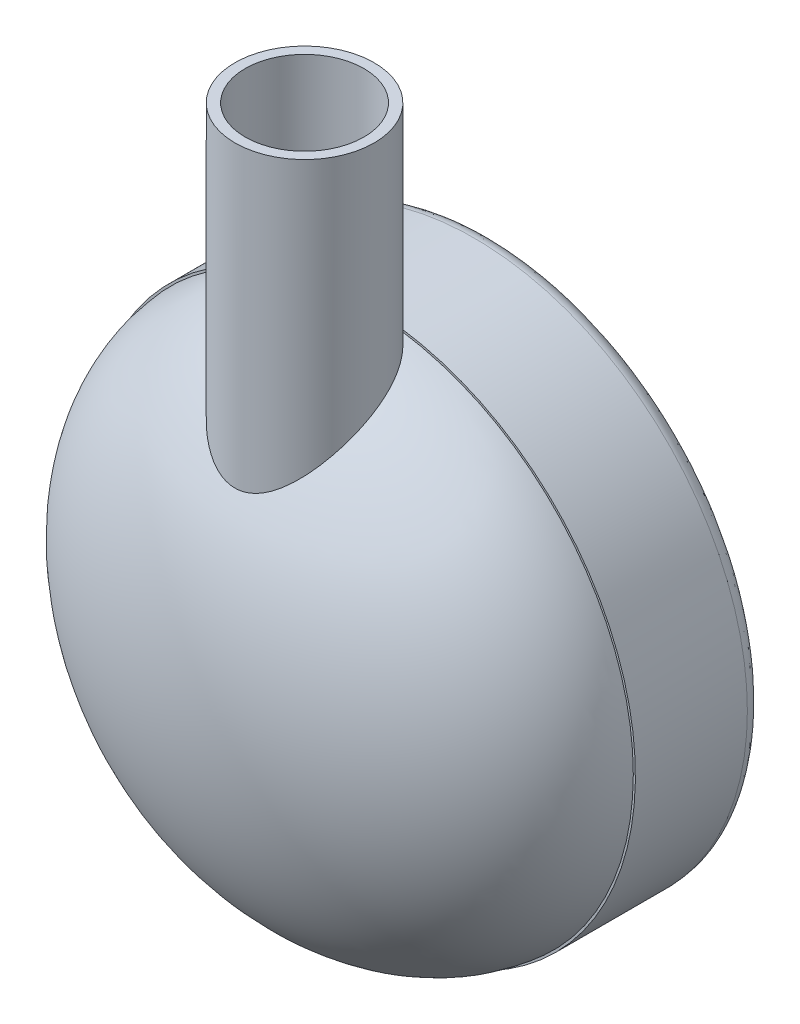
ISO-10303-21;
HEADER;
FILE_DESCRIPTION(('STEP AP214'),'2;1');
FILE_NAME('part.step','',(''),(''),'','','');
FILE_SCHEMA(('AUTOMOTIVE_DESIGN { 1 0 10303 214 1 1 1 1 }'));
ENDSEC;
DATA;
#1=APPLICATION_CONTEXT('core data for automotive mechanical design processes');
#2=APPLICATION_PROTOCOL_DEFINITION('international standard','automotive_design',2000,#1);
#3=PRODUCT_CONTEXT('',#1,'mechanical');
#4=PRODUCT('Part','Part','',(#3));
#5=PRODUCT_RELATED_PRODUCT_CATEGORY('part','',(#4));
#6=PRODUCT_DEFINITION_FORMATION('','',#4);
#7=PRODUCT_DEFINITION_CONTEXT('part definition',#1,'design');
#8=PRODUCT_DEFINITION('design','',#6,#7);
#9=PRODUCT_DEFINITION_SHAPE('','',#8);
#10=(LENGTH_UNIT() NAMED_UNIT(*) SI_UNIT(.MILLI.,.METRE.));
#11=(NAMED_UNIT(*) PLANE_ANGLE_UNIT() SI_UNIT($,.RADIAN.));
#12=(NAMED_UNIT(*) SI_UNIT($,.STERADIAN.) SOLID_ANGLE_UNIT());
#13=UNCERTAINTY_MEASURE_WITH_UNIT(LENGTH_MEASURE(1.E-05),#10,'distance_accuracy_value','');
#14=(GEOMETRIC_REPRESENTATION_CONTEXT(3) GLOBAL_UNCERTAINTY_ASSIGNED_CONTEXT((#13)) GLOBAL_UNIT_ASSIGNED_CONTEXT((#10,
#11,#12)) REPRESENTATION_CONTEXT('',''));
#15=CARTESIAN_POINT('',(0.,0.,0.));
#16=DIRECTION('',(0.,0.,1.));
#17=DIRECTION('',(1.,0.,0.));
#18=AXIS2_PLACEMENT_3D('',#15,#16,#17);
#19=CARTESIAN_POINT('',(0.,0.,30.));
#20=DIRECTION('',(0.,0.,-1.));
#21=DIRECTION('',(-1.,0.,0.));
#22=AXIS2_PLACEMENT_3D('',#19,#20,#21);
#23=CYLINDRICAL_SURFACE('',#22,80.5);
#24=CARTESIAN_POINT('',(0.,0.,0.));
#25=DIRECTION('',(0.,0.,-1.));
#26=DIRECTION('',(-1.,0.,0.));
#27=AXIS2_PLACEMENT_3D('',#24,#25,#26);
#28=CIRCLE('',#27,80.5);
#29=CARTESIAN_POINT('',(-80.5,0.,0.));
#30=VERTEX_POINT('',#29);
#31=EDGE_CURVE('E153',#30,#30,#28,.F.);
#32=ORIENTED_EDGE('',*,*,#31,.T.);
#33=EDGE_LOOP('',(#32));
#34=FACE_BOUND('',#33,.T.);
#35=CARTESIAN_POINT('',(11.4564392373896,79.6806124474455,33.));
#36=CARTESIAN_POINT('',(11.2220878181094,79.7143080596752,32.8420695559462));
#37=CARTESIAN_POINT('',(10.9844403989187,79.7474206190719,32.6889638842848));
#38=CARTESIAN_POINT('',(10.5028781935094,79.8122708437409,32.3926292261067));
#39=CARTESIAN_POINT('',(10.2589633173115,79.8440084892566,32.2494003814964));
#40=CARTESIAN_POINT('',(9.51837233566594,79.9368372093775,31.8349086606179));
#41=CARTESIAN_POINT('',(9.01279502691787,79.9955520296584,31.5788036300058));
#42=CARTESIAN_POINT('',(7.98141239486232,80.1050317111238,31.1090413243134));
#43=CARTESIAN_POINT('',(7.45560330592912,80.1557950833476,30.8953919973342));
#44=CARTESIAN_POINT('',(6.38735518565271,80.247984486276,30.5122188539234));
#45=CARTESIAN_POINT('',(5.84491709910179,80.2894110463477,30.3426925357756));
#46=CARTESIAN_POINT('',(4.74650586940751,80.3618315878747,30.048952789869));
#47=CARTESIAN_POINT('',(4.19051693906464,80.3928127093453,29.9247952025444));
#48=CARTESIAN_POINT('',(3.0696105183615,80.4434100431825,29.7231224558775));
#49=CARTESIAN_POINT('',(2.50469279579955,80.4630259594851,29.6456085116022));
#50=CARTESIAN_POINT('',(1.37040728600083,80.4903325010212,29.5379291297171));
#51=CARTESIAN_POINT('',(0.801042291539302,80.4980300868901,29.5077360552813));
#52=CARTESIAN_POINT('',(-0.338240826486871,80.5013047403233,29.4948760425023));
#53=CARTESIAN_POINT('',(-0.908158928664438,80.4968822592235,29.5122073344118));
#54=CARTESIAN_POINT('',(-2.03495667165941,80.4762153616848,29.5935613022524));
#55=CARTESIAN_POINT('',(-2.59189615721838,80.4601674796119,29.6568077918934));
#56=CARTESIAN_POINT('',(-3.69833472982087,80.4169066962689,29.8285899591556));
#57=CARTESIAN_POINT('',(-4.24783336397076,80.3896931185167,29.9371283808294));
#58=CARTESIAN_POINT('',(-5.33551582789555,80.3248345972038,30.1986091992802));
#59=CARTESIAN_POINT('',(-5.87370010188997,80.2871900640048,30.3515498492515));
#60=CARTESIAN_POINT('',(-6.9349197652561,80.2024957635583,30.7005457520391));
#61=CARTESIAN_POINT('',(-7.45795910394596,80.1554484740048,30.8965896481999));
#62=CARTESIAN_POINT('',(-8.58287968067422,80.0434930923536,31.3714279836359));
#63=CARTESIAN_POINT('',(-9.18098787882736,79.9768898911349,31.6588587115187));
#64=CARTESIAN_POINT('',(-10.0536599917039,79.8702687768623,32.1315015853088));
#65=CARTESIAN_POINT('',(-10.3401930960773,79.8336492123653,32.2957793417602));
#66=CARTESIAN_POINT('',(-10.9047898713895,79.7584893744684,32.6378450439411));
#67=CARTESIAN_POINT('',(-11.182854172701,79.7199492445909,32.8156319806594));
#68=CARTESIAN_POINT('',(-11.4564392373896,79.6806124474455,33.));
#69=B_SPLINE_CURVE_WITH_KNOTS('',3,(#35,#36,#37,#38,#39,#40,#41,#42,#43,#44,#45,#46,#47,#48,#49,
#50,#51,#52,#53,#54,#55,#56,#57,#58,#59,#60,#61,#62,#63,#64,#65,#66,#67,#68),.UNSPECIFIED.,.F.,
.F.,(4,2,2,2,2,2,2,2,2,2,2,2,2,2,2,2,4),(0.,0.853678396150907,1.7073690550526,3.41455112675234,
5.12205249828092,6.82945703564197,8.53895604650668,10.248499587896,11.9570443313581,
13.6655254516456,15.3457783163897,17.0261329955513,18.7064215776792,20.386267974087,
22.3834734499622,23.380073619323,24.3765994248601),.UNSPECIFIED.);
#70=CARTESIAN_POINT('',(11.4564392373896,79.6806124474455,33.));
#71=VERTEX_POINT('',#70);
#72=CARTESIAN_POINT('',(-11.4564392373896,79.6806124474455,33.));
#73=VERTEX_POINT('',#72);
#74=EDGE_CURVE('E11',#71,#73,#69,.T.);
#75=ORIENTED_EDGE('',*,*,#74,.F.);
#76=CARTESIAN_POINT('',(0.,0.,33.));
#77=DIRECTION('',(0.,0.,1.));
#78=DIRECTION('',(1.,0.,0.));
#79=AXIS2_PLACEMENT_3D('',#76,#77,#78);
#80=CIRCLE('',#79,80.5);
#81=EDGE_CURVE('E154',#73,#71,#80,.T.);
#82=ORIENTED_EDGE('',*,*,#81,.F.);
#83=EDGE_LOOP('',(#75,#82));
#84=FACE_BOUND('',#83,.T.);
#85=ADVANCED_FACE('F35',(#34,#84),#23,.T.);
#86=CARTESIAN_POINT('',(0.,0.,33.));
#87=DIRECTION('',(0.,0.,1.));
#88=DIRECTION('',(1.,0.,0.));
#89=AXIS2_PLACEMENT_3D('',#86,#87,#88);
#90=PLANE('',#89);
#91=CARTESIAN_POINT('',(0.,0.,33.));
#92=DIRECTION('',(0.,0.,1.));
#93=DIRECTION('',(1.,0.,0.));
#94=AXIS2_PLACEMENT_3D('',#91,#92,#93);
#95=CIRCLE('',#94,79.8813474866826);
#96=CARTESIAN_POINT('',(11.4564392373896,79.0555480424248,33.));
#97=VERTEX_POINT('',#96);
#98=CARTESIAN_POINT('',(-11.4564392373896,79.0555480424248,33.));
#99=VERTEX_POINT('',#98);
#100=EDGE_CURVE('E158',#97,#99,#95,.F.);
#101=ORIENTED_EDGE('',*,*,#100,.T.);
#102=DIRECTION('',(0.,-1.,0.));
#103=VECTOR('',#102,1.);
#104=CARTESIAN_POINT('',(-11.4564392373896,140.,33.));
#105=LINE('',#104,#103);
#106=EDGE_CURVE('E50',#99,#73,#105,.F.);
#107=ORIENTED_EDGE('',*,*,#106,.T.);
#108=ORIENTED_EDGE('',*,*,#81,.T.);
#109=DIRECTION('',(0.,-1.,0.));
#110=VECTOR('',#109,1.);
#111=CARTESIAN_POINT('',(11.4564392373896,140.,33.));
#112=LINE('',#111,#110);
#113=EDGE_CURVE('E168',#71,#97,#112,.T.);
#114=ORIENTED_EDGE('',*,*,#113,.T.);
#115=EDGE_LOOP('',(#101,#107,#108,#114));
#116=FACE_BOUND('',#115,.T.);
#117=ADVANCED_FACE('F130',(#116),#90,.T.);
#118=CARTESIAN_POINT('',(0.,0.,30.1));
#119=DIRECTION('',(0.,1.,0.));
#120=DIRECTION('',(1.,0.,0.));
#121=AXIS2_PLACEMENT_3D('',#118,#119,#120);
#122=ELLIPSE('',#121,77.,50.);
#123=TRIMMED_CURVE('',#122,(PARAMETER_VALUE(4.71238898038469)),
(PARAMETER_VALUE(7.85398163397448)),.T.,.PARAMETER.);
#124=CARTESIAN_POINT('',(0.,0.,-19.9));
#125=DIRECTION('',(0.,0.,1.));
#126=AXIS1_PLACEMENT('',#124,#125);
#127=SURFACE_OF_REVOLUTION('',#123,#126);
#128=OFFSET_SURFACE('',#127,-3.,.F.);
#129=ORIENTED_EDGE('',*,*,#100,.F.);
#130=CARTESIAN_POINT('',(1.1771202021654,51.9456892143006,70.4661766832414));
#131=CARTESIAN_POINT('',(0.907322077847377,51.9242769759187,70.4816936369536));
#132=CARTESIAN_POINT('',(0.636616901980984,51.9101660988673,70.4919048306884));
#133=CARTESIAN_POINT('',(0.0945109224228792,51.8968023200685,70.5015757745882));
#134=CARTESIAN_POINT('',(-0.176890176285591,51.8975573837835,70.5010297608304));
#135=CARTESIAN_POINT('',(-0.719021243421869,51.9139298703364,70.4891805670991));
#136=CARTESIAN_POINT('',(-0.989751179835766,51.9295479889568,70.4778768835279));
#137=CARTESIAN_POINT('',(-1.52973580034227,51.975406116933,70.4446375255701));
#138=CARTESIAN_POINT('',(-1.79898748676616,52.0056691330893,70.4226851221563));
#139=CARTESIAN_POINT('',(-2.33445363247133,52.0803076170262,70.3684249940721));
#140=CARTESIAN_POINT('',(-2.60066824041427,52.1246823909547,70.3361177785302));
#141=CARTESIAN_POINT('',(-3.12905815096226,52.2268183924922,70.2615451526845));
#142=CARTESIAN_POINT('',(-3.39123368659885,52.2845788447155,70.2192803191883));
#143=CARTESIAN_POINT('',(-4.0364719146983,52.4436324671629,70.1024934274612));
#144=CARTESIAN_POINT('',(-4.41666767779466,52.5524684520911,70.0222570684141));
#145=CARTESIAN_POINT('',(-5.16438605811431,52.7946124625367,69.8425571078895));
#146=CARTESIAN_POINT('',(-5.53190858512191,52.9279206622192,69.7430933695732));
#147=CARTESIAN_POINT('',(-6.25329881600127,53.2158528450043,69.5266008811629));
#148=CARTESIAN_POINT('',(-6.60716061790826,53.3704859122358,69.4095646435065));
#149=CARTESIAN_POINT('',(-7.30058918475854,53.698008791176,69.1595226604113));
#150=CARTESIAN_POINT('',(-7.64015137454638,53.8709043848257,69.0265118555653));
#151=CARTESIAN_POINT('',(-8.23410023492203,54.1937407892544,68.7757896973052));
#152=CARTESIAN_POINT('',(-8.49125808991869,54.3407562266536,68.6608301731225));
#153=CARTESIAN_POINT('',(-8.99654084786696,54.6431111748135,68.4225473472501));
#154=CARTESIAN_POINT('',(-9.24466751808899,54.7984490421293,68.299225695576));
#155=CARTESIAN_POINT('',(-9.97601874239879,55.2755027078987,67.9173594752607));
#156=CARTESIAN_POINT('',(-10.4460302263319,55.6081567376633,67.6469922735699));
#157=CARTESIAN_POINT('',(-11.3528707859573,56.2958336028017,67.0777527424232));
#158=CARTESIAN_POINT('',(-11.7896220298923,56.6509055518844,66.7788170332602));
#159=CARTESIAN_POINT('',(-12.6302937681159,57.3770357567384,66.1554768323128));
#160=CARTESIAN_POINT('',(-13.0342157844136,57.7480932701749,65.8310735226146));
#161=CARTESIAN_POINT('',(-13.7911471814128,58.4829143872954,65.1753863548209));
#162=CARTESIAN_POINT('',(-14.1456887019945,58.8461253088704,64.8452439719049));
#163=CARTESIAN_POINT('',(-14.8270608371628,59.5798222856372,64.1647505843524));
#164=CARTESIAN_POINT('',(-15.153882417462,59.9503106645641,63.8143930533724));
#165=CARTESIAN_POINT('',(-15.7801436114819,60.6958439483162,63.094453700841));
#166=CARTESIAN_POINT('',(-16.0795789922769,61.0708895474099,62.7248689212486));
#167=CARTESIAN_POINT('',(-16.6512937658079,61.8234519987607,61.9670319489944));
#168=CARTESIAN_POINT('',(-16.9235547214568,62.2009703461203,61.5787673437578));
#169=CARTESIAN_POINT('',(-17.4404274881262,62.9561473161747,60.7845223676012));
#170=CARTESIAN_POINT('',(-17.6850440675943,63.3338059033691,60.378545068785));
#171=CARTESIAN_POINT('',(-18.146137783587,64.0874539158083,59.5494856203579));
#172=CARTESIAN_POINT('',(-18.3626152572949,64.4634433610019,59.126403675787));
#173=CARTESIAN_POINT('',(-18.8710324349779,65.405442696745,58.040891132559));
#174=CARTESIAN_POINT('',(-19.1442188091166,65.9693221923184,57.3676759768447));
#175=CARTESIAN_POINT('',(-19.6201896410432,67.0835967827264,55.9859990803645));
#176=CARTESIAN_POINT('',(-19.8229654201098,67.6339902075194,55.2775330069105));
#177=CARTESIAN_POINT('',(-20.1526472167949,68.7147504924083,53.8301778893839));
#178=CARTESIAN_POINT('',(-20.2796985811014,69.2451538757294,53.0913500563877));
#179=CARTESIAN_POINT('',(-20.4092370685412,70.0219804287761,51.9637156058618));
#180=CARTESIAN_POINT('',(-20.4422432129018,70.2777673975958,51.5846455115601));
#181=CARTESIAN_POINT('',(-20.4871433911399,70.7825608256285,50.8206220873119));
#182=CARTESIAN_POINT('',(-20.4990323239405,71.0315656322417,50.4356673585165));
#183=CARTESIAN_POINT('',(-20.5012687837532,71.6337047855752,49.4844662464468));
#184=CARTESIAN_POINT('',(-20.4793457671317,71.9826379527059,48.9154686817445));
#185=CARTESIAN_POINT('',(-20.386520941057,72.6622895218595,47.7707814448194));
#186=CARTESIAN_POINT('',(-20.315630618574,72.9930121761445,47.195093373219));
#187=CARTESIAN_POINT('',(-20.1226235184678,73.6342469324265,46.0412092338059));
#188=CARTESIAN_POINT('',(-20.0005230200324,73.9447654209162,45.4630140207434));
#189=CARTESIAN_POINT('',(-19.7031915917022,74.5438835462094,44.3088362918556));
#190=CARTESIAN_POINT('',(-19.5279591041156,74.8324825400801,43.732853841404));
#191=CARTESIAN_POINT('',(-19.1216919812357,75.3880698138824,42.5848770925239));
#192=CARTESIAN_POINT('',(-18.8902907883314,75.6549000849168,42.01293549095));
#193=CARTESIAN_POINT('',(-18.3717704514017,76.1635904647641,40.8832990708541));
#194=CARTESIAN_POINT('',(-18.0846504887596,76.4054502066315,40.3256044617841));
#195=CARTESIAN_POINT('',(-17.4552379696664,76.8634083602064,39.2313935958132));
#196=CARTESIAN_POINT('',(-17.1129639954091,77.0795154058658,38.6948702815182));
#197=CARTESIAN_POINT('',(-16.3746843348328,77.4858690895823,37.6497411285205));
#198=CARTESIAN_POINT('',(-15.9786851785477,77.6761188648476,37.1411319075316));
#199=CARTESIAN_POINT('',(-15.1833395976969,78.0110167953899,36.2142897816272));
#200=CARTESIAN_POINT('',(-14.7894516624078,78.1583892872092,35.7923450914721));
#201=CARTESIAN_POINT('',(-13.963945089781,78.4336807148475,34.9802332770595));
#202=CARTESIAN_POINT('',(-13.5323294340281,78.5616011857555,34.5900636463494));
#203=CARTESIAN_POINT('',(-12.6344865014243,78.798783008375,33.8457518432893));
#204=CARTESIAN_POINT('',(-12.1682672309346,78.9080486571294,33.4916013817269));
#205=CARTESIAN_POINT('',(-11.2046237950124,79.1089501535856,32.8229720202554));
#206=CARTESIAN_POINT('',(-10.7072002621657,79.2005863585258,32.5084923165132));
#207=CARTESIAN_POINT('',(-9.71308122610797,79.3627378315489,31.9385452204431));
#208=CARTESIAN_POINT('',(-9.217839978377,79.4341354157128,31.6807881803416));
#209=CARTESIAN_POINT('',(-8.20650000205881,79.5630653322533,31.2059746090839));
#210=CARTESIAN_POINT('',(-7.69040220427248,79.6205982825945,30.9889162640302));
#211=CARTESIAN_POINT('',(-6.64107736025471,79.7226586845498,30.597431299746));
#212=CARTESIAN_POINT('',(-6.10785135808902,79.7671869272147,30.4230020875751));
#213=CARTESIAN_POINT('',(-5.0280696930589,79.8439923901004,30.1182693173141));
#214=CARTESIAN_POINT('',(-4.48151391537729,79.8762695047554,29.9879661394515));
#215=CARTESIAN_POINT('',(-3.38213762977831,79.9290140241954,29.7732093941544));
#216=CARTESIAN_POINT('',(-2.82937024900087,79.9495473844521,29.6884999241046));
#217=CARTESIAN_POINT('',(-1.71846873707464,79.9794817957322,29.5645104870098));
#218=CARTESIAN_POINT('',(-1.16033464304923,79.9888829237053,29.5252302059433));
#219=CARTESIAN_POINT('',(-0.0426348133667449,79.9967404021298,29.4924215879434));
#220=CARTESIAN_POINT('',(0.516930952818645,79.9951965172174,29.4988942348901));
#221=CARTESIAN_POINT('',(1.63352568984627,79.981132388497,29.5575405047663));
#222=CARTESIAN_POINT('',(2.19055465276768,79.9686121104403,29.609714270293));
#223=CARTESIAN_POINT('',(3.29940587938717,79.9323057649505,29.7595050949258));
#224=CARTESIAN_POINT('',(3.85121321399227,79.9084938423339,29.857226438343));
#225=CARTESIAN_POINT('',(4.94438279551877,79.8491401208951,30.0973307393149));
#226=CARTESIAN_POINT('',(5.48574503484767,79.8135983135469,30.2397137293327));
#227=CARTESIAN_POINT('',(6.55413754048841,79.7301524607554,30.5679244182238));
#228=CARTESIAN_POINT('',(7.08116833265006,79.6822488695694,30.7537505206738));
#229=CARTESIAN_POINT('',(8.11715019456334,79.5733020380668,31.1672380170337));
#230=CARTESIAN_POINT('',(8.62610132012107,79.5122588383122,31.3948992817987));
#231=CARTESIAN_POINT('',(9.62148517442134,79.3762710297497,31.8896327521961));
#232=CARTESIAN_POINT('',(10.1079533474255,79.301349304289,32.1566399369514));
#233=CARTESIAN_POINT('',(11.055839558376,79.1366300501333,32.7279237160461));
#234=CARTESIAN_POINT('',(11.5172576907231,79.0468325775024,33.0322001699229));
#235=CARTESIAN_POINT('',(12.4118327227233,78.8514836245726,33.6751785456396));
#236=CARTESIAN_POINT('',(12.8449926042794,78.7459338103892,34.0138768254968));
#237=CARTESIAN_POINT('',(13.6802556470681,78.518268901804,34.7225468403027));
#238=CARTESIAN_POINT('',(14.0823588167057,78.3961538118853,35.0925185667876));
#239=CARTESIAN_POINT('',(14.8532663326133,78.134621901284,35.8604575353818));
#240=CARTESIAN_POINT('',(15.2220512048624,77.9951950737505,36.2584409111974));
#241=CARTESIAN_POINT('',(15.9240312570464,77.6986314480868,37.0784469809502));
#242=CARTESIAN_POINT('',(16.2572266065858,77.5414947343619,37.500469560312));
#243=CARTESIAN_POINT('',(16.8864951122361,77.2092812649813,38.3646239632747));
#244=CARTESIAN_POINT('',(17.182568446949,77.034204595646,38.8067556901123));
#245=CARTESIAN_POINT('',(17.7365850648614,76.6661362589002,39.7071390783724));
#246=CARTESIAN_POINT('',(17.9945275386152,76.4731442113219,40.1653910817422));
#247=CARTESIAN_POINT('',(18.4789661422905,76.0634564281631,41.1080367439036));
#248=CARTESIAN_POINT('',(18.7042827207194,75.8462222397968,41.5928021065092));
#249=CARTESIAN_POINT('',(19.1139306544606,75.3936353853955,42.5710766161553));
#250=CARTESIAN_POINT('',(19.2982613976317,75.1582824488199,43.064585893671));
#251=CARTESIAN_POINT('',(19.6264803003974,74.670228860003,44.0565755032191));
#252=CARTESIAN_POINT('',(19.7703586081951,74.4175240004819,44.5550570156363));
#253=CARTESIAN_POINT('',(20.0185345183694,73.8958447636008,45.553331196245));
#254=CARTESIAN_POINT('',(20.1228304033197,73.6268696808853,46.0531239203809));
#255=CARTESIAN_POINT('',(20.3011745686234,73.0474970049427,47.0983623381649));
#256=CARTESIAN_POINT('',(20.3713991303193,72.735593507576,47.6436256309278));
#257=CARTESIAN_POINT('',(20.4677661011136,72.0953793302413,48.7283469150668));
#258=CARTESIAN_POINT('',(20.4939060656841,71.7670677414703,49.2678045828682));
#259=CARTESIAN_POINT('',(20.504199166487,71.0957504723526,50.338028712117));
#260=CARTESIAN_POINT('',(20.488342720104,70.7527414559595,50.8687931621684));
#261=CARTESIAN_POINT('',(20.4167659998571,70.0539223400622,51.9190519936218));
#262=CARTESIAN_POINT('',(20.3610437740988,69.6981116145752,52.4385458219122));
#263=CARTESIAN_POINT('',(20.1993870506859,68.9153502735979,53.5496840080363));
#264=CARTESIAN_POINT('',(20.0866384084262,68.4864165678735,54.1389445188542));
#265=CARTESIAN_POINT('',(19.8127793303399,67.6165098091767,55.2969690100044));
#266=CARTESIAN_POINT('',(19.6516640264606,67.1755355483984,55.8657309207175));
#267=CARTESIAN_POINT('',(19.2835219150062,66.2839433391161,56.9814982050357));
#268=CARTESIAN_POINT('',(19.076441513706,65.8333146926493,57.5284772953151));
#269=CARTESIAN_POINT('',(18.6186656736487,64.9258670846442,58.5984844190038));
#270=CARTESIAN_POINT('',(18.3679690081691,64.4690479493298,59.1215117782397));
#271=CARTESIAN_POINT('',(17.7729642070943,63.4651436499892,60.2394040452609));
#272=CARTESIAN_POINT('',(17.4199200057796,62.9173972899812,60.8290395737282));
#273=CARTESIAN_POINT('',(16.6558939430737,61.8228260147167,61.9709363867893));
#274=CARTESIAN_POINT('',(16.2448961721914,61.2760013943514,62.5231873466984));
#275=CARTESIAN_POINT('',(15.5854407823421,60.4617300390441,63.3215241953936));
#276=CARTESIAN_POINT('',(15.3584969428227,60.1913375612607,63.5825957927927));
#277=CARTESIAN_POINT('',(14.8901308072383,59.6534181564866,64.0944799059744));
#278=CARTESIAN_POINT('',(14.6487099580886,59.385890946264,64.3452934428056));
#279=CARTESIAN_POINT('',(14.1512912742608,58.8548354385286,64.8362063307022));
#280=CARTESIAN_POINT('',(13.895298669451,58.5913057487611,65.076309471277));
#281=CARTESIAN_POINT('',(13.3684128846053,58.0693784103112,65.5454153707341));
#282=CARTESIAN_POINT('',(13.0975211557918,57.8109802651254,65.774419206651));
#283=CARTESIAN_POINT('',(12.4635991998946,57.2302559953883,66.2823873111317));
#284=CARTESIAN_POINT('',(12.0957643658158,56.9099560020582,66.5577091602875));
#285=CARTESIAN_POINT('',(11.3343236236478,56.2833342617706,67.0879588640849));
#286=CARTESIAN_POINT('',(10.9407182511496,55.9770122245327,67.3428871423231));
#287=CARTESIAN_POINT('',(10.1271765009311,55.3828983742401,67.830168041198));
#288=CARTESIAN_POINT('',(9.7072692788626,55.0950867355827,68.0625449560657));
#289=CARTESIAN_POINT('',(8.83992473532099,54.5429162877016,68.5024874419867));
#290=CARTESIAN_POINT('',(8.39249622519334,54.2785500376027,68.7100608922464));
#291=CARTESIAN_POINT('',(7.59274379165925,53.8461834715702,69.0455997624353));
#292=CARTESIAN_POINT('',(7.2468601861312,53.6712801023486,69.1800365900208));
#293=CARTESIAN_POINT('',(6.54018969075469,53.340456932967,69.4323611041268));
#294=CARTESIAN_POINT('',(6.17940243129355,53.1845376039928,69.5502483798968));
#295=CARTESIAN_POINT('',(5.44450762515922,52.8953014319189,69.7674920959832));
#296=CARTESIAN_POINT('',(5.07043542313343,52.7619293616728,69.8668938761944));
#297=CARTESIAN_POINT('',(4.30963089458942,52.5207479444899,70.04569005327));
#298=CARTESIAN_POINT('',(3.92290491352988,52.4129260019783,70.1250943096313));
#299=CARTESIAN_POINT('',(3.14691571187569,52.2279792884577,70.2607659958531));
#300=CARTESIAN_POINT('',(2.75787702886373,52.1502564387376,70.3174850291038));
#301=CARTESIAN_POINT('',(2.16880584909803,52.0562636596495,70.3859134832237));
#302=CARTESIAN_POINT('',(1.97146517115217,52.0286927201201,70.4059517392339));
#303=CARTESIAN_POINT('',(1.57528839865156,51.9813141606931,70.4403521217919));
#304=CARTESIAN_POINT('',(1.37645185824074,51.9615089571093,70.4547124816703));
#305=CARTESIAN_POINT('',(1.1771202021654,51.9456892143006,70.4661766832414));
#306=B_SPLINE_CURVE_WITH_KNOTS('',3,(#130,#131,#132,#133,#134,#135,#136,#137,#138,#139,#140,
#141,#142,#143,#144,#145,#146,#147,#148,#149,#150,#151,#152,#153,#154,#155,#156,#157,#158,#159,
#160,#161,#162,#163,#164,#165,#166,#167,#168,#169,#170,#171,#172,#173,#174,#175,#176,#177,#178,
#179,#180,#181,#182,#183,#184,#185,#186,#187,#188,#189,#190,#191,#192,#193,#194,#195,#196,#197,
#198,#199,#200,#201,#202,#203,#204,#205,#206,#207,#208,#209,#210,#211,#212,#213,#214,#215,#216,
#217,#218,#219,#220,#221,#222,#223,#224,#225,#226,#227,#228,#229,#230,#231,#232,#233,#234,#235,
#236,#237,#238,#239,#240,#241,#242,#243,#244,#245,#246,#247,#248,#249,#250,#251,#252,#253,#254,
#255,#256,#257,#258,#259,#260,#261,#262,#263,#264,#265,#266,#267,#268,#269,#270,#271,#272,#273,
#274,#275,#276,#277,#278,#279,#280,#281,#282,#283,#284,#285,#286,#287,#288,#289,#290,#291,#292,
#293,#294,#295,#296,#297,#298,#299,#300,#301,#302,#303,#304,#305),.UNSPECIFIED.,.T.,.F.,(4,2,2,
2,2,2,2,2,2,2,2,2,2,2,2,2,2,2,2,2,2,2,2,2,2,2,2,2,2,2,2,2,2,2,2,2,2,2,2,2,2,2,2,2,2,2,2,2,2,2,2,
2,2,2,2,2,2,2,2,2,2,2,2,2,2,2,2,2,2,2,2,2,2,2,2,2,2,2,2,2,2,2,2,2,2,2,2,4),(0.,0.81315493336653,
1.62674558293071,2.44037432089323,3.25528542109145,4.0701564596413,4.8849803073549,
6.09393424780538,7.30289679253896,8.51237594035041,9.72223916524155,10.6751035062472,
11.6277803720644,13.5338059080191,15.4441627507244,17.354430976029,19.1698464656726,
20.9858513672469,22.8021364854575,24.6196456430681,26.436840813913,28.2540142077935,
31.0095048142594,33.7653349385677,36.5158582985822,37.8908358417147,39.2661454794888,
41.2675566229334,43.2684984257526,45.2688046313057,47.2691694863029,49.2829573465363,
51.2967747954503,53.3099151729461,55.3228110818923,57.1077357291391,58.892519442865,
60.6768914844845,62.461227364254,64.1477694066228,65.8342362637399,67.5206005150417,
69.2069792971204,70.8837915825168,72.5605922771682,74.2374290301925,75.9142710153281,
77.594971248123,79.2756727025656,80.9563124052304,82.6369469198524,84.3148346266696,
85.9927160099529,87.6704200503557,89.3481236367131,91.0268015549748,92.7054714730035,
94.3841333142707,96.0628307852194,97.7920326788469,99.5212603971172,101.250908887894,
102.980632417137,104.874987958924,106.76944854086,108.664341432385,110.559327107358,
112.769740915621,114.980377274303,117.193604826417,119.40689463638,122.040661126654,
124.675152054766,125.992032711561,127.308781970422,128.625061585856,129.941213217723,
131.620397100603,133.299546095956,134.976865608574,136.653650870037,137.883475681858,
139.113331011838,140.340128866347,141.566320676115,142.766716175079,143.36730278737,
143.968076124559),.UNSPECIFIED.);
#307=EDGE_CURVE('E155',#97,#99,#306,.T.);
#308=ORIENTED_EDGE('',*,*,#307,.T.);
#309=EDGE_LOOP('',(#129,#308));
#310=FACE_BOUND('',#309,.T.);
#311=CARTESIAN_POINT('',(0.,0.,83.1));
#312=VERTEX_POINT('',#311);
#313=VERTEX_LOOP('',#312);
#314=FACE_BOUND('',#313,.T.);
#315=ADVANCED_FACE('F135',(#310,#314),#128,.F.);
#316=CARTESIAN_POINT('',(0.,0.,0.));
#317=DIRECTION('',(0.,-1.,0.));
#318=DIRECTION('',(1.,0.,0.));
#319=AXIS2_PLACEMENT_3D('',#316,#317,#318);
#320=ELLIPSE('',#319,77.5,10.);
#321=TRIMMED_CURVE('',#320,(PARAMETER_VALUE(4.71238898038469)),
(PARAMETER_VALUE(7.85398163397448)),.T.,.PARAMETER.);
#322=CARTESIAN_POINT('',(0.,0.,10.));
#323=DIRECTION('',(0.,0.,-1.));
#324=AXIS1_PLACEMENT('',#322,#323);
#325=SURFACE_OF_REVOLUTION('',#321,#324);
#326=OFFSET_SURFACE('',#325,-3.,.F.);
#327=CARTESIAN_POINT('',(0.,0.,-13.));
#328=VERTEX_POINT('',#327);
#329=VERTEX_LOOP('',#328);
#330=FACE_BOUND('',#329,.T.);
#331=ORIENTED_EDGE('',*,*,#31,.F.);
#332=EDGE_LOOP('',(#331));
#333=FACE_BOUND('',#332,.T.);
#334=ADVANCED_FACE('F143',(#330,#333),#326,.F.);
#335=CARTESIAN_POINT('',(0.,140.,50.));
#336=DIRECTION('',(0.,-1.,0.));
#337=DIRECTION('',(0.,0.,-1.));
#338=AXIS2_PLACEMENT_3D('',#335,#336,#337);
#339=CYLINDRICAL_SURFACE('',#338,20.5);
#340=ORIENTED_EDGE('',*,*,#113,.F.);
#341=ORIENTED_EDGE('',*,*,#74,.T.);
#342=ORIENTED_EDGE('',*,*,#106,.F.);
#343=ORIENTED_EDGE('',*,*,#307,.F.);
#344=EDGE_LOOP('',(#340,#341,#342,#343));
#345=FACE_BOUND('',#344,.T.);
#346=CARTESIAN_POINT('',(0.,140.,50.));
#347=DIRECTION('',(0.,1.,0.));
#348=DIRECTION('',(0.,0.,1.));
#349=AXIS2_PLACEMENT_3D('',#346,#347,#348);
#350=CIRCLE('',#349,20.5);
#351=CARTESIAN_POINT('',(0.,140.,70.5));
#352=VERTEX_POINT('',#351);
#353=EDGE_CURVE('E161',#352,#352,#350,.T.);
#354=ORIENTED_EDGE('',*,*,#353,.F.);
#355=EDGE_LOOP('',(#354));
#356=FACE_BOUND('',#355,.T.);
#357=ADVANCED_FACE('F140',(#345,#356),#339,.T.);
#358=CARTESIAN_POINT('',(0.,140.,50.));
#359=DIRECTION('',(0.,1.,0.));
#360=DIRECTION('',(0.,0.,1.));
#361=AXIS2_PLACEMENT_3D('',#358,#359,#360);
#362=PLANE('',#361);
#363=CARTESIAN_POINT('',(0.,140.,50.));
#364=DIRECTION('',(0.,1.,0.));
#365=DIRECTION('',(0.,0.,1.));
#366=AXIS2_PLACEMENT_3D('',#363,#364,#365);
#367=CIRCLE('',#366,17.5);
#368=CARTESIAN_POINT('',(0.,140.,67.5));
#369=VERTEX_POINT('',#368);
#370=EDGE_CURVE('E90',#369,#369,#367,.T.);
#371=ORIENTED_EDGE('',*,*,#370,.F.);
#372=EDGE_LOOP('',(#371));
#373=FACE_BOUND('',#372,.T.);
#374=ORIENTED_EDGE('',*,*,#353,.T.);
#375=EDGE_LOOP('',(#374));
#376=FACE_BOUND('',#375,.T.);
#377=ADVANCED_FACE('F82',(#373,#376),#362,.T.);
#378=CARTESIAN_POINT('',(0.,0.,30.1));
#379=DIRECTION('',(0.,1.,0.));
#380=DIRECTION('',(1.,0.,0.));
#381=AXIS2_PLACEMENT_3D('',#378,#379,#380);
#382=ELLIPSE('',#381,77.,50.);
#383=TRIMMED_CURVE('',#382,(PARAMETER_VALUE(4.71238898038469)),
(PARAMETER_VALUE(7.85398163397448)),.T.,.PARAMETER.);
#384=CARTESIAN_POINT('',(0.,0.,-19.9));
#385=DIRECTION('',(0.,0.,1.));
#386=AXIS1_PLACEMENT('',#384,#385);
#387=SURFACE_OF_REVOLUTION('',#383,#386);
#388=CARTESIAN_POINT('',(0.,0.,30.1));
#389=DIRECTION('',(0.,0.,1.));
#390=DIRECTION('',(1.,0.,0.));
#391=AXIS2_PLACEMENT_3D('',#388,#389,#390);
#392=CIRCLE('',#391,77.);
#393=CARTESIAN_POINT('',(77.,0.,30.1));
#394=VERTEX_POINT('',#393);
#395=EDGE_CURVE('E89',#394,#394,#392,.T.);
#396=ORIENTED_EDGE('',*,*,#395,.F.);
#397=EDGE_LOOP('',(#396));
#398=FACE_BOUND('',#397,.T.);
#399=CARTESIAN_POINT('',(0.,0.,80.1));
#400=VERTEX_POINT('',#399);
#401=VERTEX_LOOP('',#400);
#402=FACE_BOUND('',#401,.T.);
#403=CARTESIAN_POINT('',(0.,76.9112448475514,32.5));
#404=CARTESIAN_POINT('',(0.471695618437623,76.9112448848337,32.500000284432));
#405=CARTESIAN_POINT('',(0.943396275700006,76.9055001783026,32.5190856408857));
#406=CARTESIAN_POINT('',(1.88343781254569,76.8824480857891,32.5952581514741));
#407=CARTESIAN_POINT('',(2.35177865115627,76.8651405590406,32.6523457682496));
#408=CARTESIAN_POINT('',(3.28178581260566,76.8187467364987,32.8040158676035));
#409=CARTESIAN_POINT('',(3.74345175418254,76.7896597706095,32.8986004832636));
#410=CARTESIAN_POINT('',(4.65679010617664,76.7193662653355,33.124408233112));
#411=CARTESIAN_POINT('',(5.10846255801118,76.6781597761892,33.2556312154244));
#412=CARTESIAN_POINT('',(5.9985562288119,76.5831900729099,33.5534945316611));
#413=CARTESIAN_POINT('',(6.43697899101438,76.5294283275456,33.720130722588));
#414=CARTESIAN_POINT('',(7.29753847256379,76.4088345963689,34.087276495179));
#415=CARTESIAN_POINT('',(7.71967522194327,76.3420026346602,34.2877860143745));
#416=CARTESIAN_POINT('',(8.5446942516795,76.1947363516022,34.7207589435015));
#417=CARTESIAN_POINT('',(8.94757843635856,76.1143033791517,34.953219184249));
#418=CARTESIAN_POINT('',(9.73141942549196,75.9393078314808,35.4478781523584));
#419=CARTESIAN_POINT('',(10.1123762027415,75.8447452387307,35.710076916615));
#420=CARTESIAN_POINT('',(10.8510702103049,75.640709161647,36.2625451005961));
#421=CARTESIAN_POINT('',(11.2087304889926,75.5311896295346,36.552900372163));
#422=CARTESIAN_POINT('',(11.8973538382753,75.2971130199467,37.1581501041056));
#423=CARTESIAN_POINT('',(12.2283169916668,75.1725559891103,37.4730444883715));
#424=CARTESIAN_POINT('',(12.8617538086739,74.9081948699054,38.1243255870933));
#425=CARTESIAN_POINT('',(13.1642278297391,74.768390972885,38.460712031802));
#426=CARTESIAN_POINT('',(13.7393098916233,74.4734969359856,39.1517990943596));
#427=CARTESIAN_POINT('',(14.0119173507664,74.3184064985003,39.5065000687011));
#428=CARTESIAN_POINT('',(14.5337868370072,73.9883560525087,40.2415138746984));
#429=CARTESIAN_POINT('',(14.7821393298711,73.8129493554605,40.6222715627547));
#430=CARTESIAN_POINT('',(15.2456166383832,73.4464801852649,41.3962415267336));
#431=CARTESIAN_POINT('',(15.4607409842734,73.2554174908417,41.7894539786389));
#432=CARTESIAN_POINT('',(15.8576764783504,72.8581689475092,42.5850307451313));
#433=CARTESIAN_POINT('',(16.0394812259388,72.6519802035595,42.9873968014465));
#434=CARTESIAN_POINT('',(16.3700126369507,72.2252521812032,43.7980389774142));
#435=CARTESIAN_POINT('',(16.5187379610791,72.0047123222264,44.2063153356461));
#436=CARTESIAN_POINT('',(16.7952034502496,71.53047077246,45.0613644650403));
#437=CARTESIAN_POINT('',(16.9200115199889,71.2755511549866,45.5084095418396));
#438=CARTESIAN_POINT('',(17.1324482599605,70.7510681784687,46.4027102549216));
#439=CARTESIAN_POINT('',(17.2200750436448,70.4815040771577,46.849965900736));
#440=CARTESIAN_POINT('',(17.3595773893862,69.9290152550511,47.7419255916114));
#441=CARTESIAN_POINT('',(17.411443051196,69.6460868575771,48.1866288963093));
#442=CARTESIAN_POINT('',(17.4809514205715,69.0683155786521,49.0709619360845));
#443=CARTESIAN_POINT('',(17.4985896886291,68.7734711566803,49.5105910056512));
#444=CARTESIAN_POINT('',(17.5014589895137,68.1255830746925,50.4520457530058));
#445=CARTESIAN_POINT('',(17.4810936995458,67.7707375092023,50.9526512056377));
#446=CARTESIAN_POINT('',(17.399023431772,67.0491470325354,51.9417276431844));
#447=CARTESIAN_POINT('',(17.3373145990072,66.6824010147701,52.4301974921449));
#448=CARTESIAN_POINT('',(17.1748145630164,65.9389493438495,53.3932843525895));
#449=CARTESIAN_POINT('',(17.0739997645496,65.5622378059414,53.8678928143145));
#450=CARTESIAN_POINT('',(16.8353430811665,64.8011942905754,54.8013901879899));
#451=CARTESIAN_POINT('',(16.6974997449857,64.4168620149838,55.2602784830227));
#452=CARTESIAN_POINT('',(16.3552811583911,63.5649282646855,56.251578211334));
#453=CARTESIAN_POINT('',(16.1431046884665,63.0960999511127,56.7802549514395));
#454=CARTESIAN_POINT('',(15.6701103553512,62.1541621776806,57.8115012353225));
#455=CARTESIAN_POINT('',(15.4092834454393,61.6810519371759,58.3140659012086));
#456=CARTESIAN_POINT('',(14.840194996815,60.7342227077989,59.2918721374158));
#457=CARTESIAN_POINT('',(14.5318962319772,60.2605035330359,59.7670918593352));
#458=CARTESIAN_POINT('',(13.868527969628,59.3173735782858,60.6881252058183));
#459=CARTESIAN_POINT('',(13.5134677098014,58.8479619668848,61.1339446123462));
#460=CARTESIAN_POINT('',(12.8186424605192,57.9956097201753,61.9231361995638));
#461=CARTESIAN_POINT('',(12.4860561919704,57.6112052663614,62.2712589496877));
#462=CARTESIAN_POINT('',(11.7869037723456,56.8528589544104,62.9442801995405));
#463=CARTESIAN_POINT('',(11.4203341269651,56.4789181773475,63.2691763049176));
#464=CARTESIAN_POINT('',(10.6524899399724,55.7469973672916,63.8931217972596));
#465=CARTESIAN_POINT('',(10.2512739071567,55.3889919155674,64.192213117643));
#466=CARTESIAN_POINT('',(9.41189145271512,54.6945877995784,64.7622326235989));
#467=CARTESIAN_POINT('',(8.97374356791459,54.3581784434224,65.0331747871155));
#468=CARTESIAN_POINT('',(8.2257377737282,53.8325812475384,65.4498451126058));
#469=CARTESIAN_POINT('',(7.92744598050785,53.6344858098141,65.6051726487588));
#470=CARTESIAN_POINT('',(7.31477847515218,53.2529141283212,65.9015662120683));
#471=CARTESIAN_POINT('',(7.00040356741854,53.0694371545774,66.0426329514346));
#472=CARTESIAN_POINT('',(6.35579352229994,52.720374683785,66.3087503181356));
#473=CARTESIAN_POINT('',(6.02557595014683,52.5547700044447,66.4338181443417));
#474=CARTESIAN_POINT('',(5.34933567014526,52.244797703796,66.6662027877066));
#475=CARTESIAN_POINT('',(5.00331893397867,52.1004221440898,66.7735262420572));
#476=CARTESIAN_POINT('',(4.36704557185476,51.863077653782,66.9488939334734));
#477=CARTESIAN_POINT('',(4.07945184776642,51.7656004550945,67.0205022039427));
#478=CARTESIAN_POINT('',(3.49569809502534,51.5887341353345,67.1499104852944));
#479=CARTESIAN_POINT('',(3.19953899207938,51.5093430677677,67.2077119821438));
#480=CARTESIAN_POINT('',(2.60032256215025,51.3706387917012,67.3083944909407));
#481=CARTESIAN_POINT('',(2.29727179723936,51.311307272413,67.35128911121));
#482=CARTESIAN_POINT('',(1.6859008270359,51.2142564211055,67.421319876987));
#483=CARTESIAN_POINT('',(1.37758065137911,51.1765369675785,67.4484561110916));
#484=CARTESIAN_POINT('',(0.756359294116368,51.1237125456039,67.4864305038167));
#485=CARTESIAN_POINT('',(0.443442581312366,51.1087269843586,67.4971826079491));
#486=CARTESIAN_POINT('',(-0.182762956481495,51.1022294019449,67.5018466090621));
#487=CARTESIAN_POINT('',(-0.496051782114687,51.1107174214183,67.4957584768858));
#488=CARTESIAN_POINT('',(-1.12046629766472,51.1508994468461,67.4668911555629));
#489=CARTESIAN_POINT('',(-1.43159112170813,51.1826022567375,67.4441056341248));
#490=CARTESIAN_POINT('',(-2.0491180588837,51.26823931758,67.3823880682397));
#491=CARTESIAN_POINT('',(-2.35552015516241,51.3221736478469,67.3434559661861));
#492=CARTESIAN_POINT('',(-2.94036774775252,51.4462296295707,67.2535673746807));
#493=CARTESIAN_POINT('',(-3.21927130931008,51.5149578325251,67.2036404575657));
#494=CARTESIAN_POINT('',(-3.77005222204429,51.6688088660892,67.0913935355855));
#495=CARTESIAN_POINT('',(-4.04192703025484,51.753937538702,67.0290691143535));
#496=CARTESIAN_POINT('',(-4.57762062996851,51.9389206944863,66.8929502555476));
#497=CARTESIAN_POINT('',(-4.84144003135525,52.0387740594818,66.8191566889044));
#498=CARTESIAN_POINT('',(-5.36051488492899,52.2515722837837,66.6609884108744));
#499=CARTESIAN_POINT('',(-5.61576814256173,52.3645204653217,66.5766110138611));
#500=CARTESIAN_POINT('',(-6.28547727142139,52.681483789539,66.3383121913171));
#501=CARTESIAN_POINT('',(-6.69200142583452,52.895806648829,66.1756766796295));
#502=CARTESIAN_POINT('',(-7.4799265896247,53.3499308730849,65.8267678604621));
#503=CARTESIAN_POINT('',(-7.8613133058082,53.589746534254,65.6404812781095));
#504=CARTESIAN_POINT('',(-8.60042957937779,54.0900014597378,65.2465875757855));
#505=CARTESIAN_POINT('',(-8.9580905478889,54.3504961103233,65.0389227232138));
#506=CARTESIAN_POINT('',(-9.64947829607607,54.8870294603708,64.6049363663092));
#507=CARTESIAN_POINT('',(-9.98320621250321,55.1630674204572,64.3786157491703));
#508=CARTESIAN_POINT('',(-10.632523331181,55.7313106477143,63.9055093080934));
#509=CARTESIAN_POINT('',(-10.9477692117696,56.0236952310821,63.6584693047569));
#510=CARTESIAN_POINT('',(-11.5556762880894,56.6179006367445,63.1481519064904));
#511=CARTESIAN_POINT('',(-11.8483278844354,56.9197253940928,62.8848676946012));
#512=CARTESIAN_POINT('',(-12.4116724458596,57.5302875176022,62.3431402342471));
#513=CARTESIAN_POINT('',(-12.6823613962228,57.8390261344966,62.0646942297214));
#514=CARTESIAN_POINT('',(-13.2024132430159,58.4615406598546,61.4932862004095));
#515=CARTESIAN_POINT('',(-13.4517603912784,58.7753200885933,61.2003137039953));
#516=CARTESIAN_POINT('',(-13.9291391112848,59.4058852363028,60.6007491702734));
#517=CARTESIAN_POINT('',(-14.1571754355282,59.7226702675567,60.2941601921667));
#518=CARTESIAN_POINT('',(-14.5920395217196,60.357772400903,59.667869748443));
#519=CARTESIAN_POINT('',(-14.7988675412855,60.6760894843364,59.348168442168));
#520=CARTESIAN_POINT('',(-15.2986089667151,61.4872569588543,58.5175909904681));
#521=CARTESIAN_POINT('',(-15.5766822348722,61.9802791570899,57.9978495422076));
#522=CARTESIAN_POINT('',(-16.0803287812365,62.9622144906341,56.9297642499958));
#523=CARTESIAN_POINT('',(-16.3058967641717,63.4511272067038,56.3814175279613));
#524=CARTESIAN_POINT('',(-16.7018262644038,64.4201188359482,55.2586091431401));
#525=CARTESIAN_POINT('',(-16.8722436293152,64.9002062182502,54.6841745745367));
#526=CARTESIAN_POINT('',(-17.1547490700488,65.8478565276846,53.5111758085742));
#527=CARTESIAN_POINT('',(-17.266849070874,66.3154219967929,52.9126165713323));
#528=CARTESIAN_POINT('',(-17.4150609185112,67.1570942526409,51.7964892445175));
#529=CARTESIAN_POINT('',(-17.4607435563544,67.5337570907136,51.2821108706115));
#530=CARTESIAN_POINT('',(-17.5060843284768,68.2731221462676,50.2413548096714));
#531=CARTESIAN_POINT('',(-17.5057446852167,68.6358250370423,49.7149777032951));
#532=CARTESIAN_POINT('',(-17.4562268137059,69.3444747332386,48.6539033147475));
#533=CARTESIAN_POINT('',(-17.407090875798,69.6904357760562,48.1192136318281));
#534=CARTESIAN_POINT('',(-17.2572501791928,70.3634391698435,47.0451417086422));
#535=CARTESIAN_POINT('',(-17.1565530329447,70.6904843056096,46.5057601726288));
#536=CARTESIAN_POINT('',(-16.9207342141706,71.2746541587572,45.5101478341873));
#537=CARTESIAN_POINT('',(-16.7932753019985,71.5348029656246,45.0538699401642));
#538=CARTESIAN_POINT('',(-16.4984176077465,72.0385065601977,44.1450568160864));
#539=CARTESIAN_POINT('',(-16.3310226465498,72.2820629325213,43.6925212322689));
#540=CARTESIAN_POINT('',(-15.9555042662764,72.7513561054794,42.7952554153913));
#541=CARTESIAN_POINT('',(-15.7473889902453,72.9770964562278,42.3505236411084));
#542=CARTESIAN_POINT('',(-15.2901113729998,73.4098429109334,41.4731488645602));
#543=CARTESIAN_POINT('',(-15.0409484222565,73.6168487366255,41.0405060419189));
#544=CARTESIAN_POINT('',(-14.5005396511079,74.0124219613034,40.1898245759739));
#545=CARTESIAN_POINT('',(-14.2090858082448,74.2008900021668,39.7718716095815));
#546=CARTESIAN_POINT('',(-13.5861044068091,74.5577825187258,38.9577875161014));
#547=CARTESIAN_POINT('',(-13.2545761711677,74.7262066556783,38.561656757871));
#548=CARTESIAN_POINT('',(-12.5533064223242,75.0429097245633,37.7961522259198));
#549=CARTESIAN_POINT('',(-12.1835706746895,75.1911916881845,37.4267744294062));
#550=CARTESIAN_POINT('',(-11.4083770750427,75.4678718593848,36.7194057099769));
#551=CARTESIAN_POINT('',(-11.0029224269926,75.5962718475207,36.3814119775061));
#552=CARTESIAN_POINT('',(-10.1985126485351,75.8227141332531,35.7707598450642));
#553=CARTESIAN_POINT('',(-9.80242501141242,75.9224658492573,35.4949499050898));
#554=CARTESIAN_POINT('',(-8.986227746757,76.106540088517,34.975632092895));
#555=CARTESIAN_POINT('',(-8.56611955889895,76.1908635351981,34.7321222876601));
#556=CARTESIAN_POINT('',(-7.70507713203002,76.3446564104714,34.2800065648833));
#557=CARTESIAN_POINT('',(-7.26414852578056,76.4141298288013,34.0713912755615));
#558=CARTESIAN_POINT('',(-6.36469141766331,76.5388650606036,33.6911348501221));
#559=CARTESIAN_POINT('',(-5.90616341753146,76.5941272788737,33.5194926608702));
#560=CARTESIAN_POINT('',(-5.00383909660586,76.688020665991,33.2243386329599));
#561=CARTESIAN_POINT('',(-4.56088434848867,76.7274687520158,33.0985073925232));
#562=CARTESIAN_POINT('',(-3.66561514613027,76.7947738108572,32.8820172137107));
#563=CARTESIAN_POINT('',(-3.21330118861112,76.8226313971694,32.7913564137489));
#564=CARTESIAN_POINT('',(-2.30240585624499,76.867070441331,32.6459906817759));
#565=CARTESIAN_POINT('',(-1.84382474085409,76.8836523645513,32.591284265853));
#566=CARTESIAN_POINT('',(-0.923497418433425,76.9057397038248,32.5182882780799));
#567=CARTESIAN_POINT('',(-0.46175112351817,76.911244811055,32.4999997215645));
#568=CARTESIAN_POINT('',(0.,76.9112448475514,32.5));
#569=B_SPLINE_CURVE_WITH_KNOTS('',3,(#403,#404,#405,#406,#407,#408,#409,#410,#411,#412,#413,
#414,#415,#416,#417,#418,#419,#420,#421,#422,#423,#424,#425,#426,#427,#428,#429,#430,#431,#432,
#433,#434,#435,#436,#437,#438,#439,#440,#441,#442,#443,#444,#445,#446,#447,#448,#449,#450,#451,
#452,#453,#454,#455,#456,#457,#458,#459,#460,#461,#462,#463,#464,#465,#466,#467,#468,#469,#470,
#471,#472,#473,#474,#475,#476,#477,#478,#479,#480,#481,#482,#483,#484,#485,#486,#487,#488,#489,
#490,#491,#492,#493,#494,#495,#496,#497,#498,#499,#500,#501,#502,#503,#504,#505,#506,#507,#508,
#509,#510,#511,#512,#513,#514,#515,#516,#517,#518,#519,#520,#521,#522,#523,#524,#525,#526,#527,
#528,#529,#530,#531,#532,#533,#534,#535,#536,#537,#538,#539,#540,#541,#542,#543,#544,#545,#546,
#547,#548,#549,#550,#551,#552,#553,#554,#555,#556,#557,#558,#559,#560,#561,#562,#563,#564,#565,
#566,#567,#568),.UNSPECIFIED.,.T.,.F.,(4,2,2,2,2,2,2,2,2,2,2,2,2,2,2,2,2,2,2,2,2,2,2,2,2,2,2,2,
2,2,2,2,2,2,2,2,2,2,2,2,2,2,2,2,2,2,2,2,2,2,2,2,2,2,2,2,2,2,2,2,2,2,2,2,2,2,2,2,2,2,2,2,2,2,2,2,
2,2,2,2,2,2,4),(0.,1.41467541410649,2.82936805083977,4.24414117636511,5.65890843736287,
7.07351027552311,8.48810950493198,9.90256852171873,11.31702929335,12.7359472732207,
14.1548608523936,15.5737566262656,16.9926800293944,18.4528700524453,19.9130807168306,
21.3735715901215,22.834121583927,24.4211366477069,26.0082322256993,27.5957670051349,
29.1835076840435,31.0236013707473,32.8638666555435,34.7052440267671,36.5466935778836,
38.757830869722,40.9693797410033,43.1826717641407,45.3955272077581,47.2424821211635,
49.0896271568215,50.9337116628115,52.776876035894,53.9470958542496,55.117257200831,
56.2861498566112,57.4546043000388,58.3897323202057,59.3247596509402,60.2589311494753,
61.1930973958504,62.132153461045,63.0712111521082,64.010625154349,64.9500425081885,
65.8238567155378,66.6979827612425,67.5720424609815,68.4463244020661,69.9064435225311,
71.3673858320361,72.8323824459548,74.2973094306018,75.7840097571108,77.2713382849334,
78.7589380828921,80.2476262871592,81.7359817047725,83.224319041143,85.5272442468142,
87.8304016069551,90.1312193508985,92.4315664279198,94.3473300433212,96.2630011446734,
98.1770134367143,100.090743227189,101.710541415863,103.330184692381,104.949504411133,
106.568848177809,108.19644570597,109.824070736717,111.451450514225,113.078684465174,
114.555410502834,116.032048125322,117.508288521473,118.984486863134,120.369429334046,
121.754298489373,123.139110484699,124.523961088232),.UNSPECIFIED.);
#570=CARTESIAN_POINT('',(0.,76.9112448475514,32.5));
#571=VERTEX_POINT('',#570);
#572=EDGE_CURVE('E87',#571,#571,#569,.T.);
#573=ORIENTED_EDGE('',*,*,#572,.F.);
#574=EDGE_LOOP('',(#573));
#575=FACE_BOUND('',#574,.T.);
#576=ADVANCED_FACE('F78',(#398,#402,#575),#387,.T.);
#577=CARTESIAN_POINT('',(0.,0.,30.));
#578=DIRECTION('',(0.,0.,-1.));
#579=DIRECTION('',(-1.,0.,0.));
#580=AXIS2_PLACEMENT_3D('',#577,#578,#579);
#581=CYLINDRICAL_SURFACE('',#580,77.5);
#582=CARTESIAN_POINT('',(0.,0.,30.));
#583=DIRECTION('',(0.,0.,1.));
#584=DIRECTION('',(1.,0.,0.));
#585=AXIS2_PLACEMENT_3D('',#582,#583,#584);
#586=CIRCLE('',#585,77.5);
#587=CARTESIAN_POINT('',(77.5,0.,30.));
#588=VERTEX_POINT('',#587);
#589=EDGE_CURVE('E194',#588,#588,#586,.T.);
#590=ORIENTED_EDGE('',*,*,#589,.T.);
#591=EDGE_LOOP('',(#590));
#592=FACE_BOUND('',#591,.T.);
#593=CARTESIAN_POINT('',(0.,0.,0.));
#594=DIRECTION('',(0.,0.,1.));
#595=DIRECTION('',(1.,0.,0.));
#596=AXIS2_PLACEMENT_3D('',#593,#594,#595);
#597=CIRCLE('',#596,77.5);
#598=CARTESIAN_POINT('',(77.5,0.,0.));
#599=VERTEX_POINT('',#598);
#600=EDGE_CURVE('E93',#599,#599,#597,.T.);
#601=ORIENTED_EDGE('',*,*,#600,.F.);
#602=EDGE_LOOP('',(#601));
#603=FACE_BOUND('',#602,.T.);
#604=ADVANCED_FACE('F81',(#592,#603),#581,.F.);
#605=CARTESIAN_POINT('',(0.,0.,30.));
#606=DIRECTION('',(0.,0.,1.));
#607=DIRECTION('',(1.,0.,0.));
#608=AXIS2_PLACEMENT_3D('',#605,#606,#607);
#609=PLANE('',#608);
#610=CARTESIAN_POINT('',(0.,0.,30.));
#611=DIRECTION('',(0.,0.,1.));
#612=DIRECTION('',(1.,0.,0.));
#613=AXIS2_PLACEMENT_3D('',#610,#611,#612);
#614=CIRCLE('',#613,77.);
#615=CARTESIAN_POINT('',(77.,0.,30.));
#616=VERTEX_POINT('',#615);
#617=EDGE_CURVE('E164',#616,#616,#614,.T.);
#618=ORIENTED_EDGE('',*,*,#617,.T.);
#619=EDGE_LOOP('',(#618));
#620=FACE_BOUND('',#619,.T.);
#621=ORIENTED_EDGE('',*,*,#589,.F.);
#622=EDGE_LOOP('',(#621));
#623=FACE_BOUND('',#622,.T.);
#624=ADVANCED_FACE('F120',(#620,#623),#609,.F.);
#625=CARTESIAN_POINT('',(0.,0.,0.));
#626=DIRECTION('',(0.,-1.,0.));
#627=DIRECTION('',(1.,0.,0.));
#628=AXIS2_PLACEMENT_3D('',#625,#626,#627);
#629=ELLIPSE('',#628,77.5,10.);
#630=TRIMMED_CURVE('',#629,(PARAMETER_VALUE(4.71238898038469)),
(PARAMETER_VALUE(7.85398163397448)),.T.,.PARAMETER.);
#631=CARTESIAN_POINT('',(0.,0.,10.));
#632=DIRECTION('',(0.,0.,-1.));
#633=AXIS1_PLACEMENT('',#631,#632);
#634=SURFACE_OF_REVOLUTION('',#630,#633);
#635=CARTESIAN_POINT('',(0.,0.,-10.));
#636=VERTEX_POINT('',#635);
#637=VERTEX_LOOP('',#636);
#638=FACE_BOUND('',#637,.T.);
#639=ORIENTED_EDGE('',*,*,#600,.T.);
#640=EDGE_LOOP('',(#639));
#641=FACE_BOUND('',#640,.T.);
#642=ADVANCED_FACE('F118',(#638,#641),#634,.T.);
#643=CARTESIAN_POINT('',(0.,0.,30.1));
#644=DIRECTION('',(0.,0.,-1.));
#645=DIRECTION('',(-1.,0.,0.));
#646=AXIS2_PLACEMENT_3D('',#643,#644,#645);
#647=CYLINDRICAL_SURFACE('',#646,77.);
#648=ORIENTED_EDGE('',*,*,#395,.T.);
#649=EDGE_LOOP('',(#648));
#650=FACE_BOUND('',#649,.T.);
#651=ORIENTED_EDGE('',*,*,#617,.F.);
#652=EDGE_LOOP('',(#651));
#653=FACE_BOUND('',#652,.T.);
#654=ADVANCED_FACE('F115',(#650,#653),#647,.F.);
#655=CARTESIAN_POINT('',(0.,140.,50.));
#656=DIRECTION('',(0.,-1.,0.));
#657=DIRECTION('',(0.,0.,-1.));
#658=AXIS2_PLACEMENT_3D('',#655,#656,#657);
#659=CYLINDRICAL_SURFACE('',#658,17.5);
#660=ORIENTED_EDGE('',*,*,#572,.T.);
#661=EDGE_LOOP('',(#660));
#662=FACE_BOUND('',#661,.T.);
#663=ORIENTED_EDGE('',*,*,#370,.T.);
#664=EDGE_LOOP('',(#663));
#665=FACE_BOUND('',#664,.T.);
#666=ADVANCED_FACE('F111',(#662,#665),#659,.F.);
#667=CLOSED_SHELL('',(#85,#117,#315,#334,#357,#377,#576,#604,#624,#642,#654,#666));
#668=MANIFOLD_SOLID_BREP('B2',#667);
#669=ADVANCED_BREP_SHAPE_REPRESENTATION('',(#18,#668),#14);
#670=SHAPE_DEFINITION_REPRESENTATION(#9,#669);
ENDSEC;
END-ISO-10303-21;
